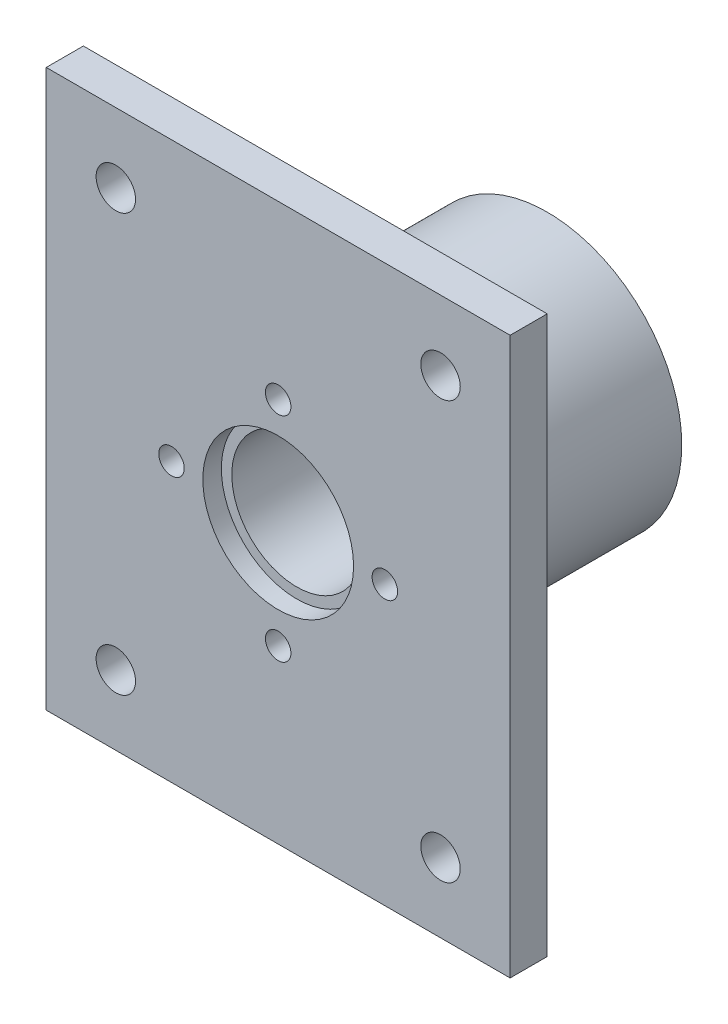
ISO-10303-21;
HEADER;
FILE_DESCRIPTION(('STEP AP214'),'2;1');
FILE_NAME('part.step','',(''),(''),'','','');
FILE_SCHEMA(('AUTOMOTIVE_DESIGN { 1 0 10303 214 1 1 1 1 }'));
ENDSEC;
DATA;
#1=APPLICATION_CONTEXT('core data for automotive mechanical design processes');
#2=APPLICATION_PROTOCOL_DEFINITION('international standard','automotive_design',2000,#1);
#3=PRODUCT_CONTEXT('',#1,'mechanical');
#4=PRODUCT('Part','Part','',(#3));
#5=PRODUCT_RELATED_PRODUCT_CATEGORY('part','',(#4));
#6=PRODUCT_DEFINITION_FORMATION('','',#4);
#7=PRODUCT_DEFINITION_CONTEXT('part definition',#1,'design');
#8=PRODUCT_DEFINITION('design','',#6,#7);
#9=PRODUCT_DEFINITION_SHAPE('','',#8);
#10=(LENGTH_UNIT() NAMED_UNIT(*) SI_UNIT(.MILLI.,.METRE.));
#11=(NAMED_UNIT(*) PLANE_ANGLE_UNIT() SI_UNIT($,.RADIAN.));
#12=(NAMED_UNIT(*) SI_UNIT($,.STERADIAN.) SOLID_ANGLE_UNIT());
#13=UNCERTAINTY_MEASURE_WITH_UNIT(LENGTH_MEASURE(1.E-05),#10,'distance_accuracy_value','');
#14=(GEOMETRIC_REPRESENTATION_CONTEXT(3) GLOBAL_UNCERTAINTY_ASSIGNED_CONTEXT((#13)) GLOBAL_UNIT_ASSIGNED_CONTEXT((#10,
#11,#12)) REPRESENTATION_CONTEXT('',''));
#15=CARTESIAN_POINT('',(0.,0.,0.));
#16=DIRECTION('',(0.,0.,1.));
#17=DIRECTION('',(1.,0.,0.));
#18=AXIS2_PLACEMENT_3D('',#15,#16,#17);
#19=CARTESIAN_POINT('',(0.,0.,-88.));
#20=DIRECTION('',(0.,0.,1.));
#21=DIRECTION('',(1.,0.,0.));
#22=AXIS2_PLACEMENT_3D('',#19,#20,#21);
#23=CYLINDRICAL_SURFACE('',#22,12.5);
#24=CARTESIAN_POINT('',(0.,0.,-27.));
#25=DIRECTION('',(0.,0.,1.));
#26=DIRECTION('',(1.,0.,0.));
#27=AXIS2_PLACEMENT_3D('',#24,#25,#26);
#28=CIRCLE('',#27,12.5);
#29=CARTESIAN_POINT('',(12.5,0.,-27.));
#30=VERTEX_POINT('',#29);
#31=EDGE_CURVE('E148',#30,#30,#28,.T.);
#32=ORIENTED_EDGE('',*,*,#31,.T.);
#33=EDGE_LOOP('',(#32));
#34=FACE_BOUND('',#33,.T.);
#35=CARTESIAN_POINT('',(0.,0.,-41.5));
#36=DIRECTION('',(0.,0.,-1.));
#37=DIRECTION('',(-1.,0.,0.));
#38=AXIS2_PLACEMENT_3D('',#35,#36,#37);
#39=CIRCLE('',#38,12.5);
#40=CARTESIAN_POINT('',(-12.5,0.,-41.5));
#41=VERTEX_POINT('',#40);
#42=EDGE_CURVE('E46',#41,#41,#39,.F.);
#43=ORIENTED_EDGE('',*,*,#42,.F.);
#44=EDGE_LOOP('',(#43));
#45=FACE_BOUND('',#44,.T.);
#46=ADVANCED_FACE('F42',(#34,#45),#23,.F.);
#47=CARTESIAN_POINT('',(-23.,0.,-62.));
#48=DIRECTION('',(0.,0.,1.));
#49=DIRECTION('',(1.,0.,0.));
#50=AXIS2_PLACEMENT_3D('',#47,#48,#49);
#51=CYLINDRICAL_SURFACE('',#50,2.75);
#52=CARTESIAN_POINT('',(-23.,0.,8.));
#53=DIRECTION('',(0.,0.,1.));
#54=DIRECTION('',(1.,0.,0.));
#55=AXIS2_PLACEMENT_3D('',#52,#53,#54);
#56=CIRCLE('',#55,2.75);
#57=CARTESIAN_POINT('',(-20.25,0.,8.));
#58=VERTEX_POINT('',#57);
#59=EDGE_CURVE('E167',#58,#58,#56,.T.);
#60=ORIENTED_EDGE('',*,*,#59,.T.);
#61=EDGE_LOOP('',(#60));
#62=FACE_BOUND('',#61,.T.);
#63=CARTESIAN_POINT('',(-23.,0.,-44.));
#64=DIRECTION('',(0.,0.,-1.));
#65=DIRECTION('',(-1.,0.,0.));
#66=AXIS2_PLACEMENT_3D('',#63,#64,#65);
#67=CIRCLE('',#66,2.75);
#68=CARTESIAN_POINT('',(-25.75,0.,-44.));
#69=VERTEX_POINT('',#68);
#70=EDGE_CURVE('E145',#69,#69,#67,.F.);
#71=ORIENTED_EDGE('',*,*,#70,.F.);
#72=EDGE_LOOP('',(#71));
#73=FACE_BOUND('',#72,.T.);
#74=ADVANCED_FACE('F249',(#62,#73),#51,.F.);
#75=CARTESIAN_POINT('',(0.,-23.,-62.));
#76=DIRECTION('',(0.,0.,1.));
#77=DIRECTION('',(1.,0.,0.));
#78=AXIS2_PLACEMENT_3D('',#75,#76,#77);
#79=CYLINDRICAL_SURFACE('',#78,2.75);
#80=CARTESIAN_POINT('',(0.,-23.,8.));
#81=DIRECTION('',(0.,0.,1.));
#82=DIRECTION('',(1.,0.,0.));
#83=AXIS2_PLACEMENT_3D('',#80,#81,#82);
#84=CIRCLE('',#83,2.75);
#85=CARTESIAN_POINT('',(2.75,-23.,8.));
#86=VERTEX_POINT('',#85);
#87=EDGE_CURVE('E178',#86,#86,#84,.T.);
#88=ORIENTED_EDGE('',*,*,#87,.T.);
#89=EDGE_LOOP('',(#88));
#90=FACE_BOUND('',#89,.T.);
#91=CARTESIAN_POINT('',(0.,-23.,-44.));
#92=DIRECTION('',(0.,0.,-1.));
#93=DIRECTION('',(-1.,0.,0.));
#94=AXIS2_PLACEMENT_3D('',#91,#92,#93);
#95=CIRCLE('',#94,2.75);
#96=CARTESIAN_POINT('',(-2.75,-23.,-44.));
#97=VERTEX_POINT('',#96);
#98=EDGE_CURVE('E142',#97,#97,#95,.F.);
#99=ORIENTED_EDGE('',*,*,#98,.F.);
#100=EDGE_LOOP('',(#99));
#101=FACE_BOUND('',#100,.T.);
#102=ADVANCED_FACE('F256',(#90,#101),#79,.F.);
#103=CARTESIAN_POINT('',(23.,0.,-62.));
#104=DIRECTION('',(0.,0.,1.));
#105=DIRECTION('',(1.,0.,0.));
#106=AXIS2_PLACEMENT_3D('',#103,#104,#105);
#107=CYLINDRICAL_SURFACE('',#106,2.75);
#108=CARTESIAN_POINT('',(23.,0.,8.));
#109=DIRECTION('',(0.,0.,1.));
#110=DIRECTION('',(1.,0.,0.));
#111=AXIS2_PLACEMENT_3D('',#108,#109,#110);
#112=CIRCLE('',#111,2.75);
#113=CARTESIAN_POINT('',(25.75,0.,8.));
#114=VERTEX_POINT('',#113);
#115=EDGE_CURVE('E174',#114,#114,#112,.T.);
#116=ORIENTED_EDGE('',*,*,#115,.T.);
#117=EDGE_LOOP('',(#116));
#118=FACE_BOUND('',#117,.T.);
#119=CARTESIAN_POINT('',(23.,0.,-44.));
#120=DIRECTION('',(0.,0.,-1.));
#121=DIRECTION('',(-1.,0.,0.));
#122=AXIS2_PLACEMENT_3D('',#119,#120,#121);
#123=CIRCLE('',#122,2.75);
#124=CARTESIAN_POINT('',(20.25,0.,-44.));
#125=VERTEX_POINT('',#124);
#126=EDGE_CURVE('E137',#125,#125,#123,.F.);
#127=ORIENTED_EDGE('',*,*,#126,.F.);
#128=EDGE_LOOP('',(#127));
#129=FACE_BOUND('',#128,.T.);
#130=ADVANCED_FACE('F277',(#118,#129),#107,.F.);
#131=CARTESIAN_POINT('',(0.,23.,-62.));
#132=DIRECTION('',(0.,0.,1.));
#133=DIRECTION('',(1.,0.,0.));
#134=AXIS2_PLACEMENT_3D('',#131,#132,#133);
#135=CYLINDRICAL_SURFACE('',#134,2.75);
#136=CARTESIAN_POINT('',(0.,23.,8.));
#137=DIRECTION('',(0.,0.,1.));
#138=DIRECTION('',(1.,0.,0.));
#139=AXIS2_PLACEMENT_3D('',#136,#137,#138);
#140=CIRCLE('',#139,2.75);
#141=CARTESIAN_POINT('',(2.75,23.,8.));
#142=VERTEX_POINT('',#141);
#143=EDGE_CURVE('E169',#142,#142,#140,.T.);
#144=ORIENTED_EDGE('',*,*,#143,.T.);
#145=EDGE_LOOP('',(#144));
#146=FACE_BOUND('',#145,.T.);
#147=CARTESIAN_POINT('',(0.,23.,-44.));
#148=DIRECTION('',(0.,0.,-1.));
#149=DIRECTION('',(-1.,0.,0.));
#150=AXIS2_PLACEMENT_3D('',#147,#148,#149);
#151=CIRCLE('',#150,2.75);
#152=CARTESIAN_POINT('',(-2.75,23.,-44.));
#153=VERTEX_POINT('',#152);
#154=EDGE_CURVE('E133',#153,#153,#151,.F.);
#155=ORIENTED_EDGE('',*,*,#154,.F.);
#156=EDGE_LOOP('',(#155));
#157=FACE_BOUND('',#156,.T.);
#158=ADVANCED_FACE('F274',(#146,#157),#135,.F.);
#159=CARTESIAN_POINT('',(-50.,-60.,8.));
#160=DIRECTION('',(1.,0.,0.));
#161=DIRECTION('',(0.,0.,-1.));
#162=AXIS2_PLACEMENT_3D('',#159,#160,#161);
#163=PLANE('',#162);
#164=DIRECTION('',(0.,-1.,0.));
#165=VECTOR('',#164,1.);
#166=CARTESIAN_POINT('',(-50.,-60.,0.));
#167=LINE('',#166,#165);
#168=CARTESIAN_POINT('',(-50.,60.,0.));
#169=VERTEX_POINT('',#168);
#170=CARTESIAN_POINT('',(-50.,-60.,0.));
#171=VERTEX_POINT('',#170);
#172=EDGE_CURVE('E116',#169,#171,#167,.T.);
#173=ORIENTED_EDGE('',*,*,#172,.T.);
#174=DIRECTION('',(0.,0.,-1.));
#175=VECTOR('',#174,1.);
#176=CARTESIAN_POINT('',(-50.,-60.,8.));
#177=LINE('',#176,#175);
#178=CARTESIAN_POINT('',(-50.,-60.,8.));
#179=VERTEX_POINT('',#178);
#180=EDGE_CURVE('E53',#179,#171,#177,.T.);
#181=ORIENTED_EDGE('',*,*,#180,.F.);
#182=DIRECTION('',(0.,-1.,0.));
#183=VECTOR('',#182,1.);
#184=CARTESIAN_POINT('',(-50.,-60.,8.));
#185=LINE('',#184,#183);
#186=CARTESIAN_POINT('',(-50.,60.,8.));
#187=VERTEX_POINT('',#186);
#188=EDGE_CURVE('E98',#187,#179,#185,.T.);
#189=ORIENTED_EDGE('',*,*,#188,.F.);
#190=DIRECTION('',(0.,0.,-1.));
#191=VECTOR('',#190,1.);
#192=CARTESIAN_POINT('',(-50.,60.,8.));
#193=LINE('',#192,#191);
#194=EDGE_CURVE('E112',#187,#169,#193,.T.);
#195=ORIENTED_EDGE('',*,*,#194,.T.);
#196=EDGE_LOOP('',(#173,#181,#189,#195));
#197=FACE_BOUND('',#196,.T.);
#198=ADVANCED_FACE('F44',(#197),#163,.F.);
#199=CARTESIAN_POINT('',(50.,-60.,8.));
#200=DIRECTION('',(0.,1.,0.));
#201=DIRECTION('',(-1.,0.,0.));
#202=AXIS2_PLACEMENT_3D('',#199,#200,#201);
#203=PLANE('',#202);
#204=DIRECTION('',(1.,0.,0.));
#205=VECTOR('',#204,1.);
#206=CARTESIAN_POINT('',(50.,-60.,0.));
#207=LINE('',#206,#205);
#208=CARTESIAN_POINT('',(50.,-60.,0.));
#209=VERTEX_POINT('',#208);
#210=EDGE_CURVE('E104',#171,#209,#207,.T.);
#211=ORIENTED_EDGE('',*,*,#210,.T.);
#212=DIRECTION('',(0.,0.,-1.));
#213=VECTOR('',#212,1.);
#214=CARTESIAN_POINT('',(50.,-60.,8.));
#215=LINE('',#214,#213);
#216=CARTESIAN_POINT('',(50.,-60.,8.));
#217=VERTEX_POINT('',#216);
#218=EDGE_CURVE('E102',#217,#209,#215,.T.);
#219=ORIENTED_EDGE('',*,*,#218,.F.);
#220=DIRECTION('',(1.,0.,0.));
#221=VECTOR('',#220,1.);
#222=CARTESIAN_POINT('',(50.,-60.,8.));
#223=LINE('',#222,#221);
#224=EDGE_CURVE('E93',#179,#217,#223,.T.);
#225=ORIENTED_EDGE('',*,*,#224,.F.);
#226=ORIENTED_EDGE('',*,*,#180,.T.);
#227=EDGE_LOOP('',(#211,#219,#225,#226));
#228=FACE_BOUND('',#227,.T.);
#229=ADVANCED_FACE('F103',(#228),#203,.F.);
#230=CARTESIAN_POINT('',(50.,-60.,8.));
#231=DIRECTION('',(-1.,0.,0.));
#232=DIRECTION('',(0.,0.,1.));
#233=AXIS2_PLACEMENT_3D('',#230,#231,#232);
#234=PLANE('',#233);
#235=DIRECTION('',(0.,1.,0.));
#236=VECTOR('',#235,1.);
#237=CARTESIAN_POINT('',(50.,-60.,0.));
#238=LINE('',#237,#236);
#239=CARTESIAN_POINT('',(50.,60.,0.));
#240=VERTEX_POINT('',#239);
#241=EDGE_CURVE('E79',#209,#240,#238,.T.);
#242=ORIENTED_EDGE('',*,*,#241,.T.);
#243=DIRECTION('',(0.,0.,-1.));
#244=VECTOR('',#243,1.);
#245=CARTESIAN_POINT('',(50.,60.,8.));
#246=LINE('',#245,#244);
#247=CARTESIAN_POINT('',(50.,60.,8.));
#248=VERTEX_POINT('',#247);
#249=EDGE_CURVE('E106',#248,#240,#246,.T.);
#250=ORIENTED_EDGE('',*,*,#249,.F.);
#251=DIRECTION('',(0.,1.,0.));
#252=VECTOR('',#251,1.);
#253=CARTESIAN_POINT('',(50.,-60.,8.));
#254=LINE('',#253,#252);
#255=EDGE_CURVE('E96',#217,#248,#254,.T.);
#256=ORIENTED_EDGE('',*,*,#255,.F.);
#257=ORIENTED_EDGE('',*,*,#218,.T.);
#258=EDGE_LOOP('',(#242,#250,#256,#257));
#259=FACE_BOUND('',#258,.T.);
#260=ADVANCED_FACE('F108',(#259),#234,.F.);
#261=CARTESIAN_POINT('',(50.,60.,8.));
#262=DIRECTION('',(0.,-1.,0.));
#263=DIRECTION('',(1.,0.,0.));
#264=AXIS2_PLACEMENT_3D('',#261,#262,#263);
#265=PLANE('',#264);
#266=DIRECTION('',(-1.,0.,0.));
#267=VECTOR('',#266,1.);
#268=CARTESIAN_POINT('',(50.,60.,0.));
#269=LINE('',#268,#267);
#270=EDGE_CURVE('E85',#240,#169,#269,.T.);
#271=ORIENTED_EDGE('',*,*,#270,.T.);
#272=ORIENTED_EDGE('',*,*,#194,.F.);
#273=DIRECTION('',(-1.,0.,0.));
#274=VECTOR('',#273,1.);
#275=CARTESIAN_POINT('',(50.,60.,8.));
#276=LINE('',#275,#274);
#277=EDGE_CURVE('E62',#248,#187,#276,.T.);
#278=ORIENTED_EDGE('',*,*,#277,.F.);
#279=ORIENTED_EDGE('',*,*,#249,.T.);
#280=EDGE_LOOP('',(#271,#272,#278,#279));
#281=FACE_BOUND('',#280,.T.);
#282=ADVANCED_FACE('F233',(#281),#265,.F.);
#283=CARTESIAN_POINT('',(0.,0.,8.));
#284=DIRECTION('',(0.,0.,1.));
#285=DIRECTION('',(1.,0.,0.));
#286=AXIS2_PLACEMENT_3D('',#283,#284,#285);
#287=PLANE('',#286);
#288=ORIENTED_EDGE('',*,*,#143,.F.);
#289=EDGE_LOOP('',(#288));
#290=FACE_BOUND('',#289,.T.);
#291=ORIENTED_EDGE('',*,*,#115,.F.);
#292=EDGE_LOOP('',(#291));
#293=FACE_BOUND('',#292,.T.);
#294=ORIENTED_EDGE('',*,*,#87,.F.);
#295=EDGE_LOOP('',(#294));
#296=FACE_BOUND('',#295,.T.);
#297=ORIENTED_EDGE('',*,*,#59,.F.);
#298=EDGE_LOOP('',(#297));
#299=FACE_BOUND('',#298,.T.);
#300=CARTESIAN_POINT('',(0.,0.,8.));
#301=DIRECTION('',(0.,0.,1.));
#302=DIRECTION('',(1.,0.,0.));
#303=AXIS2_PLACEMENT_3D('',#300,#301,#302);
#304=CIRCLE('',#303,16.25);
#305=CARTESIAN_POINT('',(16.25,0.,8.));
#306=VERTEX_POINT('',#305);
#307=EDGE_CURVE('E187',#306,#306,#304,.T.);
#308=ORIENTED_EDGE('',*,*,#307,.F.);
#309=EDGE_LOOP('',(#308));
#310=FACE_BOUND('',#309,.T.);
#311=CARTESIAN_POINT('',(-35.,-45.,8.));
#312=DIRECTION('',(0.,0.,1.));
#313=DIRECTION('',(-1.,0.,0.));
#314=AXIS2_PLACEMENT_3D('',#311,#312,#313);
#315=CIRCLE('',#314,4.25);
#316=CARTESIAN_POINT('',(-39.25,-45.,8.));
#317=VERTEX_POINT('',#316);
#318=EDGE_CURVE('E193',#317,#317,#315,.T.);
#319=ORIENTED_EDGE('',*,*,#318,.F.);
#320=EDGE_LOOP('',(#319));
#321=FACE_BOUND('',#320,.T.);
#322=CARTESIAN_POINT('',(35.,-45.,8.));
#323=DIRECTION('',(0.,0.,-1.));
#324=DIRECTION('',(1.,0.,0.));
#325=AXIS2_PLACEMENT_3D('',#322,#323,#324);
#326=CIRCLE('',#325,4.25);
#327=CARTESIAN_POINT('',(39.25,-45.,8.));
#328=VERTEX_POINT('',#327);
#329=EDGE_CURVE('E201',#328,#328,#326,.T.);
#330=ORIENTED_EDGE('',*,*,#329,.T.);
#331=EDGE_LOOP('',(#330));
#332=FACE_BOUND('',#331,.T.);
#333=CARTESIAN_POINT('',(-35.,45.,8.));
#334=DIRECTION('',(0.,0.,-1.));
#335=DIRECTION('',(-1.,0.,0.));
#336=AXIS2_PLACEMENT_3D('',#333,#334,#335);
#337=CIRCLE('',#336,4.25);
#338=CARTESIAN_POINT('',(-39.25,45.,8.));
#339=VERTEX_POINT('',#338);
#340=EDGE_CURVE('E209',#339,#339,#337,.T.);
#341=ORIENTED_EDGE('',*,*,#340,.T.);
#342=EDGE_LOOP('',(#341));
#343=FACE_BOUND('',#342,.T.);
#344=CARTESIAN_POINT('',(35.,45.,8.));
#345=DIRECTION('',(0.,0.,1.));
#346=DIRECTION('',(1.,0.,0.));
#347=AXIS2_PLACEMENT_3D('',#344,#345,#346);
#348=CIRCLE('',#347,4.25);
#349=CARTESIAN_POINT('',(39.25,45.,8.));
#350=VERTEX_POINT('',#349);
#351=EDGE_CURVE('E217',#350,#350,#348,.T.);
#352=ORIENTED_EDGE('',*,*,#351,.F.);
#353=EDGE_LOOP('',(#352));
#354=FACE_BOUND('',#353,.T.);
#355=ORIENTED_EDGE('',*,*,#188,.T.);
#356=ORIENTED_EDGE('',*,*,#224,.T.);
#357=ORIENTED_EDGE('',*,*,#255,.T.);
#358=ORIENTED_EDGE('',*,*,#277,.T.);
#359=EDGE_LOOP('',(#355,#356,#357,#358));
#360=FACE_BOUND('',#359,.T.);
#361=ADVANCED_FACE('F94',(#290,#293,#296,#299,#310,#321,#332,#343,#354,#360),#287,.T.);
#362=CARTESIAN_POINT('',(0.,0.,0.));
#363=DIRECTION('',(0.,0.,1.));
#364=DIRECTION('',(1.,0.,0.));
#365=AXIS2_PLACEMENT_3D('',#362,#363,#364);
#366=PLANE('',#365);
#367=CARTESIAN_POINT('',(0.,0.,0.));
#368=DIRECTION('',(0.,0.,-1.));
#369=DIRECTION('',(-1.,0.,0.));
#370=AXIS2_PLACEMENT_3D('',#367,#368,#369);
#371=CIRCLE('',#370,29.);
#372=CARTESIAN_POINT('',(-29.,0.,0.));
#373=VERTEX_POINT('',#372);
#374=EDGE_CURVE('E11',#373,#373,#371,.T.);
#375=ORIENTED_EDGE('',*,*,#374,.F.);
#376=EDGE_LOOP('',(#375));
#377=FACE_BOUND('',#376,.T.);
#378=CARTESIAN_POINT('',(-35.,-45.,0.));
#379=DIRECTION('',(0.,0.,1.));
#380=DIRECTION('',(-1.,0.,0.));
#381=AXIS2_PLACEMENT_3D('',#378,#379,#380);
#382=CIRCLE('',#381,4.25);
#383=CARTESIAN_POINT('',(-39.25,-45.,0.));
#384=VERTEX_POINT('',#383);
#385=EDGE_CURVE('E197',#384,#384,#382,.T.);
#386=ORIENTED_EDGE('',*,*,#385,.T.);
#387=EDGE_LOOP('',(#386));
#388=FACE_BOUND('',#387,.T.);
#389=CARTESIAN_POINT('',(35.,-45.,0.));
#390=DIRECTION('',(0.,0.,-1.));
#391=DIRECTION('',(1.,0.,0.));
#392=AXIS2_PLACEMENT_3D('',#389,#390,#391);
#393=CIRCLE('',#392,4.25);
#394=CARTESIAN_POINT('',(39.25,-45.,0.));
#395=VERTEX_POINT('',#394);
#396=EDGE_CURVE('E205',#395,#395,#393,.T.);
#397=ORIENTED_EDGE('',*,*,#396,.F.);
#398=EDGE_LOOP('',(#397));
#399=FACE_BOUND('',#398,.T.);
#400=CARTESIAN_POINT('',(-35.,45.,0.));
#401=DIRECTION('',(0.,0.,-1.));
#402=DIRECTION('',(-1.,0.,0.));
#403=AXIS2_PLACEMENT_3D('',#400,#401,#402);
#404=CIRCLE('',#403,4.25);
#405=CARTESIAN_POINT('',(-39.25,45.,0.));
#406=VERTEX_POINT('',#405);
#407=EDGE_CURVE('E213',#406,#406,#404,.T.);
#408=ORIENTED_EDGE('',*,*,#407,.F.);
#409=EDGE_LOOP('',(#408));
#410=FACE_BOUND('',#409,.T.);
#411=CARTESIAN_POINT('',(35.,45.,0.));
#412=DIRECTION('',(0.,0.,1.));
#413=DIRECTION('',(1.,0.,0.));
#414=AXIS2_PLACEMENT_3D('',#411,#412,#413);
#415=CIRCLE('',#414,4.25);
#416=CARTESIAN_POINT('',(39.25,45.,0.));
#417=VERTEX_POINT('',#416);
#418=EDGE_CURVE('E120',#417,#417,#415,.T.);
#419=ORIENTED_EDGE('',*,*,#418,.T.);
#420=EDGE_LOOP('',(#419));
#421=FACE_BOUND('',#420,.T.);
#422=ORIENTED_EDGE('',*,*,#172,.F.);
#423=ORIENTED_EDGE('',*,*,#270,.F.);
#424=ORIENTED_EDGE('',*,*,#241,.F.);
#425=ORIENTED_EDGE('',*,*,#210,.F.);
#426=EDGE_LOOP('',(#422,#423,#424,#425));
#427=FACE_BOUND('',#426,.T.);
#428=ADVANCED_FACE('F232',(#377,#388,#399,#410,#421,#427),#366,.F.);
#429=CARTESIAN_POINT('',(35.,45.,0.));
#430=DIRECTION('',(0.,0.,1.));
#431=DIRECTION('',(1.,0.,0.));
#432=AXIS2_PLACEMENT_3D('',#429,#430,#431);
#433=CYLINDRICAL_SURFACE('',#432,4.25);
#434=ORIENTED_EDGE('',*,*,#418,.F.);
#435=EDGE_LOOP('',(#434));
#436=FACE_BOUND('',#435,.T.);
#437=ORIENTED_EDGE('',*,*,#351,.T.);
#438=EDGE_LOOP('',(#437));
#439=FACE_BOUND('',#438,.T.);
#440=ADVANCED_FACE('F229',(#436,#439),#433,.F.);
#441=CARTESIAN_POINT('',(-35.,45.,0.));
#442=DIRECTION('',(0.,0.,1.));
#443=DIRECTION('',(1.,0.,0.));
#444=AXIS2_PLACEMENT_3D('',#441,#442,#443);
#445=CYLINDRICAL_SURFACE('',#444,4.25);
#446=ORIENTED_EDGE('',*,*,#407,.T.);
#447=EDGE_LOOP('',(#446));
#448=FACE_BOUND('',#447,.T.);
#449=ORIENTED_EDGE('',*,*,#340,.F.);
#450=EDGE_LOOP('',(#449));
#451=FACE_BOUND('',#450,.T.);
#452=ADVANCED_FACE('F305',(#448,#451),#445,.F.);
#453=CARTESIAN_POINT('',(35.,-45.,0.));
#454=DIRECTION('',(0.,0.,1.));
#455=DIRECTION('',(1.,0.,0.));
#456=AXIS2_PLACEMENT_3D('',#453,#454,#455);
#457=CYLINDRICAL_SURFACE('',#456,4.25);
#458=ORIENTED_EDGE('',*,*,#396,.T.);
#459=EDGE_LOOP('',(#458));
#460=FACE_BOUND('',#459,.T.);
#461=ORIENTED_EDGE('',*,*,#329,.F.);
#462=EDGE_LOOP('',(#461));
#463=FACE_BOUND('',#462,.T.);
#464=ADVANCED_FACE('F301',(#460,#463),#457,.F.);
#465=CARTESIAN_POINT('',(-35.,-45.,0.));
#466=DIRECTION('',(0.,0.,1.));
#467=DIRECTION('',(1.,0.,0.));
#468=AXIS2_PLACEMENT_3D('',#465,#466,#467);
#469=CYLINDRICAL_SURFACE('',#468,4.25);
#470=ORIENTED_EDGE('',*,*,#385,.F.);
#471=EDGE_LOOP('',(#470));
#472=FACE_BOUND('',#471,.T.);
#473=ORIENTED_EDGE('',*,*,#318,.T.);
#474=EDGE_LOOP('',(#473));
#475=FACE_BOUND('',#474,.T.);
#476=ADVANCED_FACE('F297',(#472,#475),#469,.F.);
#477=CARTESIAN_POINT('',(0.,0.,4.));
#478=DIRECTION('',(0.,0.,1.));
#479=DIRECTION('',(1.,0.,0.));
#480=AXIS2_PLACEMENT_3D('',#477,#478,#479);
#481=CYLINDRICAL_SURFACE('',#480,16.25);
#482=CARTESIAN_POINT('',(0.,0.,4.));
#483=DIRECTION('',(0.,0.,1.));
#484=DIRECTION('',(1.,0.,0.));
#485=AXIS2_PLACEMENT_3D('',#482,#483,#484);
#486=CIRCLE('',#485,16.25);
#487=CARTESIAN_POINT('',(16.25,0.,4.));
#488=VERTEX_POINT('',#487);
#489=EDGE_CURVE('E189',#488,#488,#486,.T.);
#490=ORIENTED_EDGE('',*,*,#489,.F.);
#491=EDGE_LOOP('',(#490));
#492=FACE_BOUND('',#491,.T.);
#493=ORIENTED_EDGE('',*,*,#307,.T.);
#494=EDGE_LOOP('',(#493));
#495=FACE_BOUND('',#494,.T.);
#496=ADVANCED_FACE('F293',(#492,#495),#481,.F.);
#497=CARTESIAN_POINT('',(0.,0.,4.));
#498=DIRECTION('',(0.,0.,1.));
#499=DIRECTION('',(1.,0.,0.));
#500=AXIS2_PLACEMENT_3D('',#497,#498,#499);
#501=PLANE('',#500);
#502=CARTESIAN_POINT('',(0.,0.,4.));
#503=DIRECTION('',(0.,0.,1.));
#504=DIRECTION('',(1.,0.,0.));
#505=AXIS2_PLACEMENT_3D('',#502,#503,#504);
#506=CIRCLE('',#505,14.);
#507=CARTESIAN_POINT('',(14.,0.,4.));
#508=VERTEX_POINT('',#507);
#509=EDGE_CURVE('E153',#508,#508,#506,.T.);
#510=ORIENTED_EDGE('',*,*,#509,.F.);
#511=EDGE_LOOP('',(#510));
#512=FACE_BOUND('',#511,.T.);
#513=ORIENTED_EDGE('',*,*,#489,.T.);
#514=EDGE_LOOP('',(#513));
#515=FACE_BOUND('',#514,.T.);
#516=ADVANCED_FACE('F290',(#512,#515),#501,.T.);
#517=CARTESIAN_POINT('',(0.,0.,-50.));
#518=DIRECTION('',(0.,0.,1.));
#519=DIRECTION('',(1.,0.,0.));
#520=AXIS2_PLACEMENT_3D('',#517,#518,#519);
#521=CYLINDRICAL_SURFACE('',#520,29.);
#522=CARTESIAN_POINT('',(0.,0.,-50.));
#523=DIRECTION('',(0.,0.,-1.));
#524=DIRECTION('',(-1.,0.,0.));
#525=AXIS2_PLACEMENT_3D('',#522,#523,#524);
#526=CIRCLE('',#525,29.);
#527=CARTESIAN_POINT('',(-29.,0.,-50.));
#528=VERTEX_POINT('',#527);
#529=EDGE_CURVE('E173',#528,#528,#526,.T.);
#530=ORIENTED_EDGE('',*,*,#529,.F.);
#531=EDGE_LOOP('',(#530));
#532=FACE_BOUND('',#531,.T.);
#533=ORIENTED_EDGE('',*,*,#374,.T.);
#534=EDGE_LOOP('',(#533));
#535=FACE_BOUND('',#534,.T.);
#536=ADVANCED_FACE('F286',(#532,#535),#521,.T.);
#537=CARTESIAN_POINT('',(0.,0.,-50.));
#538=DIRECTION('',(0.,0.,-1.));
#539=DIRECTION('',(-1.,0.,0.));
#540=AXIS2_PLACEMENT_3D('',#537,#538,#539);
#541=PLANE('',#540);
#542=CARTESIAN_POINT('',(0.,0.,-50.));
#543=DIRECTION('',(0.,0.,-1.));
#544=DIRECTION('',(-1.,0.,0.));
#545=AXIS2_PLACEMENT_3D('',#542,#543,#544);
#546=CIRCLE('',#545,14.);
#547=CARTESIAN_POINT('',(-14.,0.,-50.));
#548=VERTEX_POINT('',#547);
#549=EDGE_CURVE('E603',#548,#548,#546,.T.);
#550=ORIENTED_EDGE('',*,*,#549,.F.);
#551=EDGE_LOOP('',(#550));
#552=FACE_BOUND('',#551,.T.);
#553=CARTESIAN_POINT('',(0.,23.,-50.));
#554=DIRECTION('',(0.,0.,-1.));
#555=DIRECTION('',(-1.,0.,0.));
#556=AXIS2_PLACEMENT_3D('',#553,#554,#555);
#557=CIRCLE('',#556,4.15);
#558=CARTESIAN_POINT('',(-4.15,23.,-50.));
#559=VERTEX_POINT('',#558);
#560=EDGE_CURVE('E612',#559,#559,#557,.T.);
#561=ORIENTED_EDGE('',*,*,#560,.F.);
#562=EDGE_LOOP('',(#561));
#563=FACE_BOUND('',#562,.T.);
#564=CARTESIAN_POINT('',(-23.,0.,-50.));
#565=DIRECTION('',(0.,0.,-1.));
#566=DIRECTION('',(-1.,0.,0.));
#567=AXIS2_PLACEMENT_3D('',#564,#565,#566);
#568=CIRCLE('',#567,4.15);
#569=CARTESIAN_POINT('',(-27.15,0.,-50.));
#570=VERTEX_POINT('',#569);
#571=EDGE_CURVE('E616',#570,#570,#568,.T.);
#572=ORIENTED_EDGE('',*,*,#571,.F.);
#573=EDGE_LOOP('',(#572));
#574=FACE_BOUND('',#573,.T.);
#575=CARTESIAN_POINT('',(0.,-23.,-50.));
#576=DIRECTION('',(0.,0.,-1.));
#577=DIRECTION('',(-1.,0.,0.));
#578=AXIS2_PLACEMENT_3D('',#575,#576,#577);
#579=CIRCLE('',#578,4.15);
#580=CARTESIAN_POINT('',(-4.15,-23.,-50.));
#581=VERTEX_POINT('',#580);
#582=EDGE_CURVE('E624',#581,#581,#579,.T.);
#583=ORIENTED_EDGE('',*,*,#582,.F.);
#584=EDGE_LOOP('',(#583));
#585=FACE_BOUND('',#584,.T.);
#586=CARTESIAN_POINT('',(23.,0.,-50.));
#587=DIRECTION('',(0.,0.,-1.));
#588=DIRECTION('',(-1.,0.,0.));
#589=AXIS2_PLACEMENT_3D('',#586,#587,#588);
#590=CIRCLE('',#589,4.15);
#591=CARTESIAN_POINT('',(18.85,0.,-50.));
#592=VERTEX_POINT('',#591);
#593=EDGE_CURVE('E631',#592,#592,#590,.T.);
#594=ORIENTED_EDGE('',*,*,#593,.F.);
#595=EDGE_LOOP('',(#594));
#596=FACE_BOUND('',#595,.T.);
#597=ORIENTED_EDGE('',*,*,#529,.T.);
#598=EDGE_LOOP('',(#597));
#599=FACE_BOUND('',#598,.T.);
#600=ADVANCED_FACE('F272',(#552,#563,#574,#585,#596,#599),#541,.T.);
#601=CARTESIAN_POINT('',(0.,0.,-27.));
#602=DIRECTION('',(0.,0.,1.));
#603=DIRECTION('',(1.,0.,0.));
#604=AXIS2_PLACEMENT_3D('',#601,#602,#603);
#605=CYLINDRICAL_SURFACE('',#604,14.);
#606=CARTESIAN_POINT('',(0.,0.,-27.));
#607=DIRECTION('',(0.,0.,1.));
#608=DIRECTION('',(1.,0.,0.));
#609=AXIS2_PLACEMENT_3D('',#606,#607,#608);
#610=CIRCLE('',#609,14.);
#611=CARTESIAN_POINT('',(14.,0.,-27.));
#612=VERTEX_POINT('',#611);
#613=EDGE_CURVE('E159',#612,#612,#610,.T.);
#614=ORIENTED_EDGE('',*,*,#613,.F.);
#615=EDGE_LOOP('',(#614));
#616=FACE_BOUND('',#615,.T.);
#617=ORIENTED_EDGE('',*,*,#509,.T.);
#618=EDGE_LOOP('',(#617));
#619=FACE_BOUND('',#618,.T.);
#620=ADVANCED_FACE('F268',(#616,#619),#605,.F.);
#621=CARTESIAN_POINT('',(0.,0.,-27.));
#622=DIRECTION('',(0.,0.,1.));
#623=DIRECTION('',(1.,0.,0.));
#624=AXIS2_PLACEMENT_3D('',#621,#622,#623);
#625=PLANE('',#624);
#626=ORIENTED_EDGE('',*,*,#31,.F.);
#627=EDGE_LOOP('',(#626));
#628=FACE_BOUND('',#627,.T.);
#629=ORIENTED_EDGE('',*,*,#613,.T.);
#630=EDGE_LOOP('',(#629));
#631=FACE_BOUND('',#630,.T.);
#632=ADVANCED_FACE('F264',(#628,#631),#625,.T.);
#633=CARTESIAN_POINT('',(0.,23.,-44.));
#634=DIRECTION('',(0.,0.,-1.));
#635=DIRECTION('',(-1.,0.,0.));
#636=AXIS2_PLACEMENT_3D('',#633,#634,#635);
#637=PLANE('',#636);
#638=CARTESIAN_POINT('',(0.,23.,-44.));
#639=DIRECTION('',(0.,0.,-1.));
#640=DIRECTION('',(-1.,0.,0.));
#641=AXIS2_PLACEMENT_3D('',#638,#639,#640);
#642=CIRCLE('',#641,4.15);
#643=CARTESIAN_POINT('',(-4.15,23.,-44.));
#644=VERTEX_POINT('',#643);
#645=EDGE_CURVE('E138',#644,#644,#642,.T.);
#646=ORIENTED_EDGE('',*,*,#645,.T.);
#647=EDGE_LOOP('',(#646));
#648=FACE_BOUND('',#647,.T.);
#649=ORIENTED_EDGE('',*,*,#154,.T.);
#650=EDGE_LOOP('',(#649));
#651=FACE_BOUND('',#650,.T.);
#652=ADVANCED_FACE('F267',(#648,#651),#637,.T.);
#653=CARTESIAN_POINT('',(0.,23.,-44.));
#654=DIRECTION('',(0.,0.,-1.));
#655=DIRECTION('',(-1.,0.,0.));
#656=AXIS2_PLACEMENT_3D('',#653,#654,#655);
#657=CYLINDRICAL_SURFACE('',#656,4.15);
#658=ORIENTED_EDGE('',*,*,#645,.F.);
#659=EDGE_LOOP('',(#658));
#660=FACE_BOUND('',#659,.T.);
#661=ORIENTED_EDGE('',*,*,#560,.T.);
#662=EDGE_LOOP('',(#661));
#663=FACE_BOUND('',#662,.T.);
#664=ADVANCED_FACE('F412',(#660,#663),#657,.F.);
#665=CARTESIAN_POINT('',(23.,0.,-44.));
#666=DIRECTION('',(0.,0.,-1.));
#667=DIRECTION('',(-1.,0.,0.));
#668=AXIS2_PLACEMENT_3D('',#665,#666,#667);
#669=PLANE('',#668);
#670=CARTESIAN_POINT('',(23.,0.,-44.));
#671=DIRECTION('',(0.,0.,-1.));
#672=DIRECTION('',(-1.,0.,0.));
#673=AXIS2_PLACEMENT_3D('',#670,#671,#672);
#674=CIRCLE('',#673,4.15);
#675=CARTESIAN_POINT('',(18.85,0.,-44.));
#676=VERTEX_POINT('',#675);
#677=EDGE_CURVE('E163',#676,#676,#674,.T.);
#678=ORIENTED_EDGE('',*,*,#677,.T.);
#679=EDGE_LOOP('',(#678));
#680=FACE_BOUND('',#679,.T.);
#681=ORIENTED_EDGE('',*,*,#126,.T.);
#682=EDGE_LOOP('',(#681));
#683=FACE_BOUND('',#682,.T.);
#684=ADVANCED_FACE('F262',(#680,#683),#669,.T.);
#685=CARTESIAN_POINT('',(23.,0.,-44.));
#686=DIRECTION('',(0.,0.,-1.));
#687=DIRECTION('',(-1.,0.,0.));
#688=AXIS2_PLACEMENT_3D('',#685,#686,#687);
#689=CYLINDRICAL_SURFACE('',#688,4.15);
#690=ORIENTED_EDGE('',*,*,#677,.F.);
#691=EDGE_LOOP('',(#690));
#692=FACE_BOUND('',#691,.T.);
#693=ORIENTED_EDGE('',*,*,#593,.T.);
#694=EDGE_LOOP('',(#693));
#695=FACE_BOUND('',#694,.T.);
#696=ADVANCED_FACE('F426',(#692,#695),#689,.F.);
#697=CARTESIAN_POINT('',(0.,-23.,-44.));
#698=DIRECTION('',(0.,0.,-1.));
#699=DIRECTION('',(-1.,0.,0.));
#700=AXIS2_PLACEMENT_3D('',#697,#698,#699);
#701=PLANE('',#700);
#702=CARTESIAN_POINT('',(0.,-23.,-44.));
#703=DIRECTION('',(0.,0.,-1.));
#704=DIRECTION('',(-1.,0.,0.));
#705=AXIS2_PLACEMENT_3D('',#702,#703,#704);
#706=CIRCLE('',#705,4.15);
#707=CARTESIAN_POINT('',(-4.15,-23.,-44.));
#708=VERTEX_POINT('',#707);
#709=EDGE_CURVE('E628',#708,#708,#706,.T.);
#710=ORIENTED_EDGE('',*,*,#709,.T.);
#711=EDGE_LOOP('',(#710));
#712=FACE_BOUND('',#711,.T.);
#713=ORIENTED_EDGE('',*,*,#98,.T.);
#714=EDGE_LOOP('',(#713));
#715=FACE_BOUND('',#714,.T.);
#716=ADVANCED_FACE('F433',(#712,#715),#701,.T.);
#717=CARTESIAN_POINT('',(0.,-23.,-44.));
#718=DIRECTION('',(0.,0.,-1.));
#719=DIRECTION('',(-1.,0.,0.));
#720=AXIS2_PLACEMENT_3D('',#717,#718,#719);
#721=CYLINDRICAL_SURFACE('',#720,4.15);
#722=ORIENTED_EDGE('',*,*,#709,.F.);
#723=EDGE_LOOP('',(#722));
#724=FACE_BOUND('',#723,.T.);
#725=ORIENTED_EDGE('',*,*,#582,.T.);
#726=EDGE_LOOP('',(#725));
#727=FACE_BOUND('',#726,.T.);
#728=ADVANCED_FACE('F440',(#724,#727),#721,.F.);
#729=CARTESIAN_POINT('',(-23.,0.,-44.));
#730=DIRECTION('',(0.,0.,-1.));
#731=DIRECTION('',(-1.,0.,0.));
#732=AXIS2_PLACEMENT_3D('',#729,#730,#731);
#733=PLANE('',#732);
#734=CARTESIAN_POINT('',(-23.,0.,-44.));
#735=DIRECTION('',(0.,0.,-1.));
#736=DIRECTION('',(-1.,0.,0.));
#737=AXIS2_PLACEMENT_3D('',#734,#735,#736);
#738=CIRCLE('',#737,4.15);
#739=CARTESIAN_POINT('',(-27.15,0.,-44.));
#740=VERTEX_POINT('',#739);
#741=EDGE_CURVE('E620',#740,#740,#738,.T.);
#742=ORIENTED_EDGE('',*,*,#741,.T.);
#743=EDGE_LOOP('',(#742));
#744=FACE_BOUND('',#743,.T.);
#745=ORIENTED_EDGE('',*,*,#70,.T.);
#746=EDGE_LOOP('',(#745));
#747=FACE_BOUND('',#746,.T.);
#748=ADVANCED_FACE('F448',(#744,#747),#733,.T.);
#749=CARTESIAN_POINT('',(-23.,0.,-44.));
#750=DIRECTION('',(0.,0.,-1.));
#751=DIRECTION('',(-1.,0.,0.));
#752=AXIS2_PLACEMENT_3D('',#749,#750,#751);
#753=CYLINDRICAL_SURFACE('',#752,4.15);
#754=ORIENTED_EDGE('',*,*,#741,.F.);
#755=EDGE_LOOP('',(#754));
#756=FACE_BOUND('',#755,.T.);
#757=ORIENTED_EDGE('',*,*,#571,.T.);
#758=EDGE_LOOP('',(#757));
#759=FACE_BOUND('',#758,.T.);
#760=ADVANCED_FACE('F456',(#756,#759),#753,.F.);
#761=CARTESIAN_POINT('',(0.,0.,-41.5));
#762=DIRECTION('',(0.,0.,-1.));
#763=DIRECTION('',(-1.,0.,0.));
#764=AXIS2_PLACEMENT_3D('',#761,#762,#763);
#765=PLANE('',#764);
#766=CARTESIAN_POINT('',(0.,0.,-41.5));
#767=DIRECTION('',(0.,0.,-1.));
#768=DIRECTION('',(-1.,0.,0.));
#769=AXIS2_PLACEMENT_3D('',#766,#767,#768);
#770=CIRCLE('',#769,14.);
#771=CARTESIAN_POINT('',(-14.,0.,-41.5));
#772=VERTEX_POINT('',#771);
#773=EDGE_CURVE('E600',#772,#772,#770,.T.);
#774=ORIENTED_EDGE('',*,*,#773,.T.);
#775=EDGE_LOOP('',(#774));
#776=FACE_BOUND('',#775,.T.);
#777=ORIENTED_EDGE('',*,*,#42,.T.);
#778=EDGE_LOOP('',(#777));
#779=FACE_BOUND('',#778,.T.);
#780=ADVANCED_FACE('F463',(#776,#779),#765,.T.);
#781=CARTESIAN_POINT('',(0.,0.,-41.5));
#782=DIRECTION('',(0.,0.,-1.));
#783=DIRECTION('',(-1.,0.,0.));
#784=AXIS2_PLACEMENT_3D('',#781,#782,#783);
#785=CYLINDRICAL_SURFACE('',#784,14.);
#786=ORIENTED_EDGE('',*,*,#773,.F.);
#787=EDGE_LOOP('',(#786));
#788=FACE_BOUND('',#787,.T.);
#789=ORIENTED_EDGE('',*,*,#549,.T.);
#790=EDGE_LOOP('',(#789));
#791=FACE_BOUND('',#790,.T.);
#792=ADVANCED_FACE('F469',(#788,#791),#785,.F.);
#793=CLOSED_SHELL('',(#46,#74,#102,#130,#158,#198,#229,#260,#282,#361,#428,#440,#452,#464,#476,
#496,#516,#536,#600,#620,#632,#652,#664,#684,#696,#716,#728,#748,#760,#780,#792));
#794=MANIFOLD_SOLID_BREP('B2',#793);
#795=ADVANCED_BREP_SHAPE_REPRESENTATION('',(#18,#794),#14);
#796=SHAPE_DEFINITION_REPRESENTATION(#9,#795);
ENDSEC;
END-ISO-10303-21;
